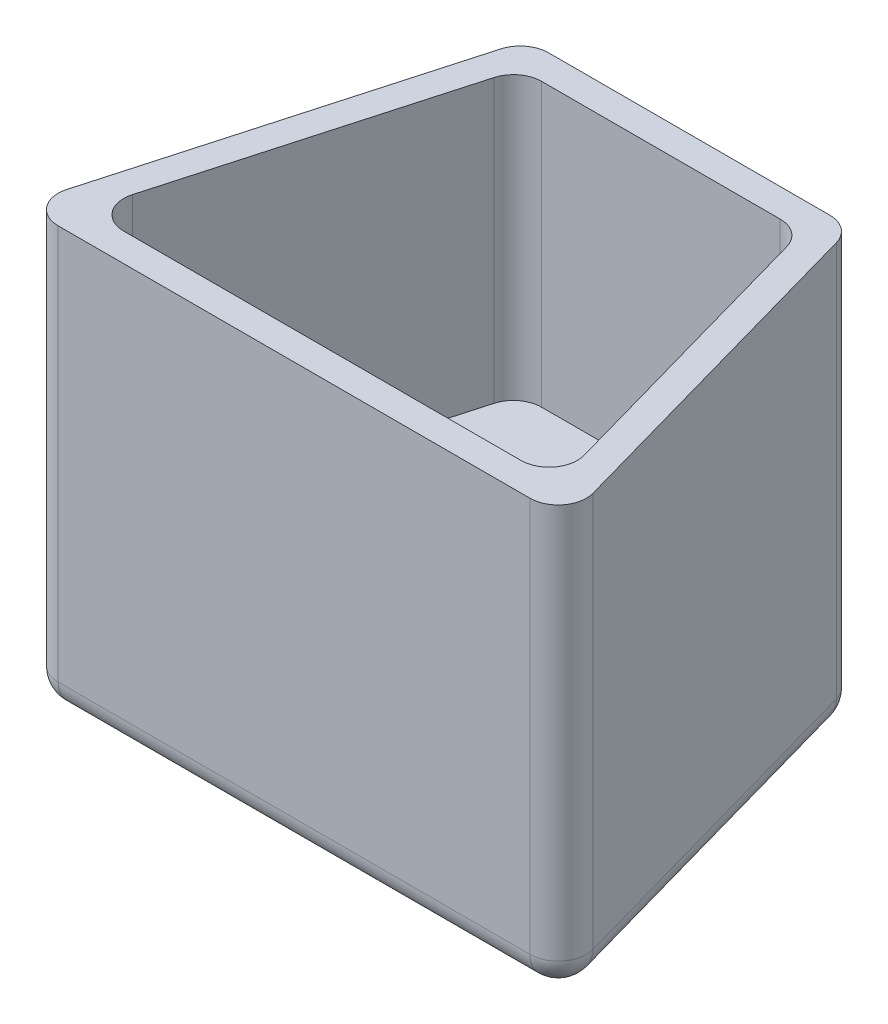
ISO-10303-21;
HEADER;
FILE_DESCRIPTION(('STEP AP214'),'2;1');
FILE_NAME('part.step','',(''),(''),'','','');
FILE_SCHEMA(('AUTOMOTIVE_DESIGN { 1 0 10303 214 1 1 1 1 }'));
ENDSEC;
DATA;
#1=APPLICATION_CONTEXT('core data for automotive mechanical design processes');
#2=APPLICATION_PROTOCOL_DEFINITION('international standard','automotive_design',2000,#1);
#3=PRODUCT_CONTEXT('',#1,'mechanical');
#4=PRODUCT('Part','Part','',(#3));
#5=PRODUCT_RELATED_PRODUCT_CATEGORY('part','',(#4));
#6=PRODUCT_DEFINITION_FORMATION('','',#4);
#7=PRODUCT_DEFINITION_CONTEXT('part definition',#1,'design');
#8=PRODUCT_DEFINITION('design','',#6,#7);
#9=PRODUCT_DEFINITION_SHAPE('','',#8);
#10=(LENGTH_UNIT() NAMED_UNIT(*) SI_UNIT(.MILLI.,.METRE.));
#11=(NAMED_UNIT(*) PLANE_ANGLE_UNIT() SI_UNIT($,.RADIAN.));
#12=(NAMED_UNIT(*) SI_UNIT($,.STERADIAN.) SOLID_ANGLE_UNIT());
#13=UNCERTAINTY_MEASURE_WITH_UNIT(LENGTH_MEASURE(1.E-05),#10,'distance_accuracy_value','');
#14=(GEOMETRIC_REPRESENTATION_CONTEXT(3) GLOBAL_UNCERTAINTY_ASSIGNED_CONTEXT((#13)) GLOBAL_UNIT_ASSIGNED_CONTEXT((#10,
#11,#12)) REPRESENTATION_CONTEXT('',''));
#15=CARTESIAN_POINT('',(0.,0.,0.));
#16=DIRECTION('',(0.,0.,1.));
#17=DIRECTION('',(1.,0.,0.));
#18=AXIS2_PLACEMENT_3D('',#15,#16,#17);
#19=CARTESIAN_POINT('',(4.98490373267567,1.,-6.));
#20=DIRECTION('',(0.,0.,-1.));
#21=DIRECTION('',(0.,1.,0.));
#22=AXIS2_PLACEMENT_3D('',#19,#20,#21);
#23=SPHERICAL_SURFACE('',#22,1.);
#24=CARTESIAN_POINT('',(4.98490373267567,1.,-6.));
#25=DIRECTION('',(1.,0.,0.));
#26=DIRECTION('',(0.,0.,-1.));
#27=AXIS2_PLACEMENT_3D('',#24,#25,#26);
#28=CIRCLE('',#27,1.);
#29=CARTESIAN_POINT('',(4.98490373267567,1.,-7.));
#30=VERTEX_POINT('',#29);
#31=CARTESIAN_POINT('',(4.98490373267566,0.,-6.));
#32=VERTEX_POINT('',#31);
#33=EDGE_CURVE('E288',#30,#32,#28,.F.);
#34=ORIENTED_EDGE('',*,*,#33,.F.);
#35=CARTESIAN_POINT('',(4.98490373267567,1.,-6.));
#36=DIRECTION('',(0.,-1.,0.));
#37=DIRECTION('',(0.,0.,-1.));
#38=AXIS2_PLACEMENT_3D('',#35,#36,#37);
#39=CIRCLE('',#38,0.999999999999998);
#40=CARTESIAN_POINT('',(5.94755467282956,1.,-6.27074557691828));
#41=VERTEX_POINT('',#40);
#42=EDGE_CURVE('E296',#41,#30,#39,.F.);
#43=ORIENTED_EDGE('',*,*,#42,.F.);
#44=CARTESIAN_POINT('',(4.98490373267566,1.,-6.));
#45=DIRECTION('',(0.270745576918284,0.,0.962650940153899));
#46=DIRECTION('',(0.962650940153899,0.,-0.270745576918284));
#47=AXIS2_PLACEMENT_3D('',#44,#45,#46);
#48=CIRCLE('',#47,1.);
#49=EDGE_CURVE('E287',#32,#41,#48,.T.);
#50=ORIENTED_EDGE('',*,*,#49,.F.);
#51=EDGE_LOOP('',(#34,#43,#50));
#52=FACE_BOUND('',#51,.T.);
#53=ADVANCED_FACE('F17',(#52),#23,.T.);
#54=CARTESIAN_POINT('',(-4.98490373267567,1.,-6.));
#55=DIRECTION('',(0.,0.,-1.));
#56=DIRECTION('',(0.,1.,0.));
#57=AXIS2_PLACEMENT_3D('',#54,#55,#56);
#58=SPHERICAL_SURFACE('',#57,1.);
#59=CARTESIAN_POINT('',(-4.98490373267567,1.,-6.));
#60=DIRECTION('',(1.,0.,0.));
#61=DIRECTION('',(0.,0.,-1.));
#62=AXIS2_PLACEMENT_3D('',#59,#60,#61);
#63=CIRCLE('',#62,1.);
#64=CARTESIAN_POINT('',(-4.98490373267567,0.,-6.));
#65=VERTEX_POINT('',#64);
#66=CARTESIAN_POINT('',(-4.98490373267567,1.,-7.));
#67=VERTEX_POINT('',#66);
#68=EDGE_CURVE('E285',#65,#67,#63,.T.);
#69=ORIENTED_EDGE('',*,*,#68,.F.);
#70=CARTESIAN_POINT('',(-4.98490373267566,1.,-6.));
#71=DIRECTION('',(0.270745576918284,0.,-0.962650940153899));
#72=DIRECTION('',(-0.962650940153899,0.,-0.270745576918284));
#73=AXIS2_PLACEMENT_3D('',#70,#71,#72);
#74=CIRCLE('',#73,1.);
#75=CARTESIAN_POINT('',(-5.94755467282956,0.999999999999997,-6.27074557691828));
#76=VERTEX_POINT('',#75);
#77=EDGE_CURVE('E427',#76,#65,#74,.F.);
#78=ORIENTED_EDGE('',*,*,#77,.F.);
#79=CARTESIAN_POINT('',(-4.98490373267567,1.,-6.));
#80=DIRECTION('',(0.,-1.,0.));
#81=DIRECTION('',(0.,0.,-1.));
#82=AXIS2_PLACEMENT_3D('',#79,#80,#81);
#83=CIRCLE('',#82,0.999999999999999);
#84=EDGE_CURVE('E280',#67,#76,#83,.F.);
#85=ORIENTED_EDGE('',*,*,#84,.F.);
#86=EDGE_LOOP('',(#69,#78,#85));
#87=FACE_BOUND('',#86,.T.);
#88=ADVANCED_FACE('F319',(#87),#58,.T.);
#89=CARTESIAN_POINT('',(4.2273555990135,15.,-5.));
#90=DIRECTION('',(0.,-1.,0.));
#91=DIRECTION('',(0.,0.,-1.));
#92=AXIS2_PLACEMENT_3D('',#89,#90,#91);
#93=CYLINDRICAL_SURFACE('',#92,0.999999999999999);
#94=CARTESIAN_POINT('',(4.2273555990135,5.,-5.));
#95=DIRECTION('',(0.,-1.,0.));
#96=DIRECTION('',(0.,0.,-1.));
#97=AXIS2_PLACEMENT_3D('',#94,#95,#96);
#98=CIRCLE('',#97,0.999999999999999);
#99=CARTESIAN_POINT('',(4.2273555990135,5.,-6.));
#100=VERTEX_POINT('',#99);
#101=CARTESIAN_POINT('',(5.1900065391674,5.,-5.27074557691828));
#102=VERTEX_POINT('',#101);
#103=EDGE_CURVE('E158',#100,#102,#98,.T.);
#104=ORIENTED_EDGE('',*,*,#103,.T.);
#105=DIRECTION('',(0.,1.,0.));
#106=VECTOR('',#105,1.);
#107=CARTESIAN_POINT('',(5.1900065391674,15.,-5.27074557691828));
#108=LINE('',#107,#106);
#109=CARTESIAN_POINT('',(5.1900065391674,15.,-5.27074557691828));
#110=VERTEX_POINT('',#109);
#111=EDGE_CURVE('E156',#110,#102,#108,.F.);
#112=ORIENTED_EDGE('',*,*,#111,.F.);
#113=CARTESIAN_POINT('',(4.2273555990135,15.,-5.));
#114=DIRECTION('',(0.,-1.,0.));
#115=DIRECTION('',(0.,0.,-1.));
#116=AXIS2_PLACEMENT_3D('',#113,#114,#115);
#117=CIRCLE('',#116,0.999999999999999);
#118=CARTESIAN_POINT('',(4.2273555990135,15.,-6.));
#119=VERTEX_POINT('',#118);
#120=EDGE_CURVE('E21',#119,#110,#117,.T.);
#121=ORIENTED_EDGE('',*,*,#120,.F.);
#122=DIRECTION('',(0.,1.,0.));
#123=VECTOR('',#122,1.);
#124=CARTESIAN_POINT('',(4.22735559901349,15.,-6.));
#125=LINE('',#124,#123);
#126=EDGE_CURVE('E252',#100,#119,#125,.T.);
#127=ORIENTED_EDGE('',*,*,#126,.F.);
#128=EDGE_LOOP('',(#104,#112,#121,#127));
#129=FACE_BOUND('',#128,.T.);
#130=ADVANCED_FACE('F157',(#129),#93,.F.);
#131=CARTESIAN_POINT('',(-4.2273555990135,15.,-5.));
#132=DIRECTION('',(0.,-1.,0.));
#133=DIRECTION('',(0.,0.,-1.));
#134=AXIS2_PLACEMENT_3D('',#131,#132,#133);
#135=CYLINDRICAL_SURFACE('',#134,1.);
#136=CARTESIAN_POINT('',(-4.2273555990135,5.,-5.));
#137=DIRECTION('',(0.,-1.,0.));
#138=DIRECTION('',(0.,0.,-1.));
#139=AXIS2_PLACEMENT_3D('',#136,#137,#138);
#140=CIRCLE('',#139,1.);
#141=CARTESIAN_POINT('',(-5.1900065391674,5.,-5.27074557691828));
#142=VERTEX_POINT('',#141);
#143=CARTESIAN_POINT('',(-4.2273555990135,5.,-6.));
#144=VERTEX_POINT('',#143);
#145=EDGE_CURVE('E432',#142,#144,#140,.T.);
#146=ORIENTED_EDGE('',*,*,#145,.T.);
#147=DIRECTION('',(0.,1.,0.));
#148=VECTOR('',#147,1.);
#149=CARTESIAN_POINT('',(-4.22735559901349,15.,-6.));
#150=LINE('',#149,#148);
#151=CARTESIAN_POINT('',(-4.2273555990135,15.,-6.));
#152=VERTEX_POINT('',#151);
#153=EDGE_CURVE('E255',#152,#144,#150,.F.);
#154=ORIENTED_EDGE('',*,*,#153,.F.);
#155=CARTESIAN_POINT('',(-4.2273555990135,15.,-5.));
#156=DIRECTION('',(0.,-1.,0.));
#157=DIRECTION('',(0.,0.,-1.));
#158=AXIS2_PLACEMENT_3D('',#155,#156,#157);
#159=CIRCLE('',#158,1.);
#160=CARTESIAN_POINT('',(-5.1900065391674,15.,-5.27074557691828));
#161=VERTEX_POINT('',#160);
#162=EDGE_CURVE('E154',#161,#152,#159,.T.);
#163=ORIENTED_EDGE('',*,*,#162,.F.);
#164=DIRECTION('',(0.,1.,0.));
#165=VECTOR('',#164,1.);
#166=CARTESIAN_POINT('',(-5.1900065391674,15.,-5.27074557691828));
#167=LINE('',#166,#165);
#168=EDGE_CURVE('E248',#142,#161,#167,.T.);
#169=ORIENTED_EDGE('',*,*,#168,.F.);
#170=EDGE_LOOP('',(#146,#154,#163,#169));
#171=FACE_BOUND('',#170,.T.);
#172=ADVANCED_FACE('F325',(#171),#135,.F.);
#173=CARTESIAN_POINT('',(-8.35990373267567,5.,6.));
#174=DIRECTION('',(0.,-1.,0.));
#175=DIRECTION('',(0.,0.,-1.));
#176=AXIS2_PLACEMENT_3D('',#173,#174,#175);
#177=PLANE('',#176);
#178=DIRECTION('',(-1.,0.,0.));
#179=VECTOR('',#178,1.);
#180=CARTESIAN_POINT('',(-7.03985559901349,5.,6.));
#181=LINE('',#180,#179);
#182=CARTESIAN_POINT('',(7.0398555990135,5.,6.));
#183=VERTEX_POINT('',#182);
#184=CARTESIAN_POINT('',(-7.0398555990135,5.,6.));
#185=VERTEX_POINT('',#184);
#186=EDGE_CURVE('E261',#183,#185,#181,.T.);
#187=ORIENTED_EDGE('',*,*,#186,.F.);
#188=CARTESIAN_POINT('',(7.0398555990135,5.,5.));
#189=DIRECTION('',(0.,-1.,0.));
#190=DIRECTION('',(0.,0.,-1.));
#191=AXIS2_PLACEMENT_3D('',#188,#189,#190);
#192=CIRCLE('',#191,1.);
#193=CARTESIAN_POINT('',(8.0025065391674,5.,4.72925442308172));
#194=VERTEX_POINT('',#193);
#195=EDGE_CURVE('E162',#183,#194,#192,.F.);
#196=ORIENTED_EDGE('',*,*,#195,.T.);
#197=DIRECTION('',(0.270745576918284,0.,0.962650940153899));
#198=VECTOR('',#197,1.);
#199=CARTESIAN_POINT('',(5.1900065391674,5.,-5.27074557691828));
#200=LINE('',#199,#198);
#201=EDGE_CURVE('E161',#102,#194,#200,.T.);
#202=ORIENTED_EDGE('',*,*,#201,.F.);
#203=ORIENTED_EDGE('',*,*,#103,.F.);
#204=DIRECTION('',(1.,0.,0.));
#205=VECTOR('',#204,1.);
#206=CARTESIAN_POINT('',(-4.22735559901349,5.,-6.));
#207=LINE('',#206,#205);
#208=EDGE_CURVE('E254',#144,#100,#207,.T.);
#209=ORIENTED_EDGE('',*,*,#208,.F.);
#210=ORIENTED_EDGE('',*,*,#145,.F.);
#211=DIRECTION('',(0.270745576918284,0.,-0.962650940153899));
#212=VECTOR('',#211,1.);
#213=CARTESIAN_POINT('',(-5.1900065391674,5.,-5.27074557691828));
#214=LINE('',#213,#212);
#215=CARTESIAN_POINT('',(-8.0025065391674,5.,4.72925442308171));
#216=VERTEX_POINT('',#215);
#217=EDGE_CURVE('E251',#216,#142,#214,.T.);
#218=ORIENTED_EDGE('',*,*,#217,.F.);
#219=CARTESIAN_POINT('',(-7.0398555990135,5.,5.));
#220=DIRECTION('',(0.,-1.,0.));
#221=DIRECTION('',(0.,0.,-1.));
#222=AXIS2_PLACEMENT_3D('',#219,#220,#221);
#223=CIRCLE('',#222,1.);
#224=EDGE_CURVE('E244',#216,#185,#223,.F.);
#225=ORIENTED_EDGE('',*,*,#224,.T.);
#226=EDGE_LOOP('',(#187,#196,#202,#203,#209,#210,#218,#225));
#227=FACE_BOUND('',#226,.T.);
#228=ADVANCED_FACE('F328',(#227),#177,.F.);
#229=CARTESIAN_POINT('',(4.98490373267567,15.,-6.));
#230=DIRECTION('',(0.,-1.,0.));
#231=DIRECTION('',(0.,0.,-1.));
#232=AXIS2_PLACEMENT_3D('',#229,#230,#231);
#233=CYLINDRICAL_SURFACE('',#232,0.999999999999998);
#234=DIRECTION('',(0.,1.,0.));
#235=VECTOR('',#234,1.);
#236=CARTESIAN_POINT('',(4.98490373267567,15.,-7.));
#237=LINE('',#236,#235);
#238=CARTESIAN_POINT('',(4.98490373267567,15.,-7.));
#239=VERTEX_POINT('',#238);
#240=EDGE_CURVE('E272',#30,#239,#237,.T.);
#241=ORIENTED_EDGE('',*,*,#240,.T.);
#242=CARTESIAN_POINT('',(4.98490373267567,15.,-6.));
#243=DIRECTION('',(0.,-1.,0.));
#244=DIRECTION('',(0.,0.,-1.));
#245=AXIS2_PLACEMENT_3D('',#242,#243,#244);
#246=CIRCLE('',#245,0.999999999999998);
#247=CARTESIAN_POINT('',(5.94755467282956,15.,-6.27074557691829));
#248=VERTEX_POINT('',#247);
#249=EDGE_CURVE('E298',#239,#248,#246,.T.);
#250=ORIENTED_EDGE('',*,*,#249,.T.);
#251=DIRECTION('',(0.,1.,0.));
#252=VECTOR('',#251,1.);
#253=CARTESIAN_POINT('',(5.94755467282956,15.,-6.27074557691828));
#254=LINE('',#253,#252);
#255=EDGE_CURVE('E237',#248,#41,#254,.F.);
#256=ORIENTED_EDGE('',*,*,#255,.T.);
#257=ORIENTED_EDGE('',*,*,#42,.T.);
#258=EDGE_LOOP('',(#241,#250,#256,#257));
#259=FACE_BOUND('',#258,.T.);
#260=ADVANCED_FACE('F332',(#259),#233,.T.);
#261=CARTESIAN_POINT('',(-4.98490373267567,1.,-6.));
#262=DIRECTION('',(1.,0.,0.));
#263=DIRECTION('',(0.,0.,-1.));
#264=AXIS2_PLACEMENT_3D('',#261,#262,#263);
#265=CYLINDRICAL_SURFACE('',#264,1.);
#266=ORIENTED_EDGE('',*,*,#68,.T.);
#267=DIRECTION('',(1.,0.,0.));
#268=VECTOR('',#267,1.);
#269=CARTESIAN_POINT('',(-4.98490373267567,1.,-7.));
#270=LINE('',#269,#268);
#271=EDGE_CURVE('E268',#67,#30,#270,.T.);
#272=ORIENTED_EDGE('',*,*,#271,.T.);
#273=ORIENTED_EDGE('',*,*,#33,.T.);
#274=DIRECTION('',(1.,0.,0.));
#275=VECTOR('',#274,1.);
#276=CARTESIAN_POINT('',(-8.35990373267567,0.,-6.));
#277=LINE('',#276,#275);
#278=EDGE_CURVE('E291',#65,#32,#277,.T.);
#279=ORIENTED_EDGE('',*,*,#278,.F.);
#280=EDGE_LOOP('',(#266,#272,#273,#279));
#281=FACE_BOUND('',#280,.T.);
#282=ADVANCED_FACE('F336',(#281),#265,.T.);
#283=CARTESIAN_POINT('',(4.98490373267566,1.,-6.));
#284=DIRECTION('',(0.270745576918284,0.,0.962650940153899));
#285=DIRECTION('',(0.962650940153899,0.,-0.270745576918284));
#286=AXIS2_PLACEMENT_3D('',#283,#284,#285);
#287=CYLINDRICAL_SURFACE('',#286,1.);
#288=CARTESIAN_POINT('',(8.35990373267567,1.,6.00000000000001));
#289=DIRECTION('',(0.270745576918284,0.,0.962650940153899));
#290=DIRECTION('',(0.962650940153899,0.,-0.270745576918284));
#291=AXIS2_PLACEMENT_3D('',#288,#289,#290);
#292=CIRCLE('',#291,1.);
#293=CARTESIAN_POINT('',(8.35990373267568,0.,6.00000000000001));
#294=VERTEX_POINT('',#293);
#295=CARTESIAN_POINT('',(9.32255467282957,1.,5.72925442308172));
#296=VERTEX_POINT('',#295);
#297=EDGE_CURVE('E238',#294,#296,#292,.T.);
#298=ORIENTED_EDGE('',*,*,#297,.F.);
#299=DIRECTION('',(0.270745576918284,0.,0.962650940153899));
#300=VECTOR('',#299,1.);
#301=CARTESIAN_POINT('',(4.98490373267567,0.,-6.));
#302=LINE('',#301,#300);
#303=EDGE_CURVE('E294',#32,#294,#302,.T.);
#304=ORIENTED_EDGE('',*,*,#303,.F.);
#305=ORIENTED_EDGE('',*,*,#49,.T.);
#306=DIRECTION('',(0.270745576918284,0.,0.962650940153899));
#307=VECTOR('',#306,1.);
#308=CARTESIAN_POINT('',(5.94755467282956,1.,-6.27074557691828));
#309=LINE('',#308,#307);
#310=EDGE_CURVE('E264',#41,#296,#309,.T.);
#311=ORIENTED_EDGE('',*,*,#310,.T.);
#312=EDGE_LOOP('',(#298,#304,#305,#311));
#313=FACE_BOUND('',#312,.T.);
#314=ADVANCED_FACE('F340',(#313),#287,.T.);
#315=CARTESIAN_POINT('',(-4.98490373267566,1.,-6.));
#316=DIRECTION('',(0.270745576918284,0.,-0.962650940153899));
#317=DIRECTION('',(-0.962650940153899,0.,-0.270745576918284));
#318=AXIS2_PLACEMENT_3D('',#315,#316,#317);
#319=CYLINDRICAL_SURFACE('',#318,1.);
#320=CARTESIAN_POINT('',(-8.35990373267567,1.,6.00000000000001));
#321=DIRECTION('',(0.270745576918284,0.,-0.962650940153899));
#322=DIRECTION('',(-0.962650940153899,0.,-0.270745576918284));
#323=AXIS2_PLACEMENT_3D('',#320,#321,#322);
#324=CIRCLE('',#323,1.);
#325=CARTESIAN_POINT('',(-8.35990373267567,0.,6.00000000000001));
#326=VERTEX_POINT('',#325);
#327=CARTESIAN_POINT('',(-9.32255467282957,0.999999999999997,5.72925442308172));
#328=VERTEX_POINT('',#327);
#329=EDGE_CURVE('E282',#326,#328,#324,.T.);
#330=ORIENTED_EDGE('',*,*,#329,.T.);
#331=DIRECTION('',(0.270745576918284,0.,-0.962650940153899));
#332=VECTOR('',#331,1.);
#333=CARTESIAN_POINT('',(-5.94755467282956,0.999999999999994,-6.27074557691828));
#334=LINE('',#333,#332);
#335=EDGE_CURVE('E279',#328,#76,#334,.T.);
#336=ORIENTED_EDGE('',*,*,#335,.T.);
#337=ORIENTED_EDGE('',*,*,#77,.T.);
#338=DIRECTION('',(0.270745576918284,0.,-0.962650940153899));
#339=VECTOR('',#338,1.);
#340=CARTESIAN_POINT('',(-8.35990373267567,0.,6.));
#341=LINE('',#340,#339);
#342=EDGE_CURVE('E295',#326,#65,#341,.T.);
#343=ORIENTED_EDGE('',*,*,#342,.F.);
#344=EDGE_LOOP('',(#330,#336,#337,#343));
#345=FACE_BOUND('',#344,.T.);
#346=ADVANCED_FACE('F344',(#345),#319,.T.);
#347=CARTESIAN_POINT('',(-4.98490373267567,15.,-6.));
#348=DIRECTION('',(0.,-1.,0.));
#349=DIRECTION('',(0.,0.,-1.));
#350=AXIS2_PLACEMENT_3D('',#347,#348,#349);
#351=CYLINDRICAL_SURFACE('',#350,0.999999999999999);
#352=DIRECTION('',(0.,1.,0.));
#353=VECTOR('',#352,1.);
#354=CARTESIAN_POINT('',(-5.94755467282956,15.,-6.27074557691828));
#355=LINE('',#354,#353);
#356=CARTESIAN_POINT('',(-5.94755467282956,15.,-6.27074557691828));
#357=VERTEX_POINT('',#356);
#358=EDGE_CURVE('E186',#76,#357,#355,.T.);
#359=ORIENTED_EDGE('',*,*,#358,.T.);
#360=CARTESIAN_POINT('',(-4.98490373267567,15.,-6.));
#361=DIRECTION('',(0.,-1.,0.));
#362=DIRECTION('',(0.,0.,-1.));
#363=AXIS2_PLACEMENT_3D('',#360,#361,#362);
#364=CIRCLE('',#363,0.999999999999999);
#365=CARTESIAN_POINT('',(-4.98490373267567,15.,-7.));
#366=VERTEX_POINT('',#365);
#367=EDGE_CURVE('E269',#357,#366,#364,.T.);
#368=ORIENTED_EDGE('',*,*,#367,.T.);
#369=DIRECTION('',(0.,1.,0.));
#370=VECTOR('',#369,1.);
#371=CARTESIAN_POINT('',(-4.98490373267567,15.,-7.));
#372=LINE('',#371,#370);
#373=EDGE_CURVE('E265',#366,#67,#372,.F.);
#374=ORIENTED_EDGE('',*,*,#373,.T.);
#375=ORIENTED_EDGE('',*,*,#84,.T.);
#376=EDGE_LOOP('',(#359,#368,#374,#375));
#377=FACE_BOUND('',#376,.T.);
#378=ADVANCED_FACE('F348',(#377),#351,.T.);
#379=CARTESIAN_POINT('',(-4.98490373267567,15.,-7.));
#380=DIRECTION('',(0.,0.,1.));
#381=DIRECTION('',(1.,0.,0.));
#382=AXIS2_PLACEMENT_3D('',#379,#380,#381);
#383=PLANE('',#382);
#384=ORIENTED_EDGE('',*,*,#271,.F.);
#385=ORIENTED_EDGE('',*,*,#373,.F.);
#386=DIRECTION('',(1.,0.,0.));
#387=VECTOR('',#386,1.);
#388=CARTESIAN_POINT('',(-8.35990373267567,15.,-7.));
#389=LINE('',#388,#387);
#390=EDGE_CURVE('E180',#366,#239,#389,.T.);
#391=ORIENTED_EDGE('',*,*,#390,.T.);
#392=ORIENTED_EDGE('',*,*,#240,.F.);
#393=EDGE_LOOP('',(#384,#385,#391,#392));
#394=FACE_BOUND('',#393,.T.);
#395=ADVANCED_FACE('F352',(#394),#383,.F.);
#396=CARTESIAN_POINT('',(-7.03985559901349,15.,6.));
#397=DIRECTION('',(0.,0.,-1.));
#398=DIRECTION('',(-1.,0.,0.));
#399=AXIS2_PLACEMENT_3D('',#396,#397,#398);
#400=PLANE('',#399);
#401=DIRECTION('',(0.,-1.,0.));
#402=VECTOR('',#401,1.);
#403=CARTESIAN_POINT('',(-7.03985559901349,15.,6.));
#404=LINE('',#403,#402);
#405=CARTESIAN_POINT('',(-7.0398555990135,15.,6.));
#406=VERTEX_POINT('',#405);
#407=EDGE_CURVE('E241',#185,#406,#404,.F.);
#408=ORIENTED_EDGE('',*,*,#407,.T.);
#409=DIRECTION('',(1.,0.,0.));
#410=VECTOR('',#409,1.);
#411=CARTESIAN_POINT('',(-8.35990373267567,15.,6.));
#412=LINE('',#411,#410);
#413=CARTESIAN_POINT('',(7.0398555990135,15.,6.));
#414=VERTEX_POINT('',#413);
#415=EDGE_CURVE('E171',#406,#414,#412,.T.);
#416=ORIENTED_EDGE('',*,*,#415,.T.);
#417=DIRECTION('',(0.,-1.,0.));
#418=VECTOR('',#417,1.);
#419=CARTESIAN_POINT('',(7.03985559901349,15.,6.));
#420=LINE('',#419,#418);
#421=EDGE_CURVE('E258',#414,#183,#420,.T.);
#422=ORIENTED_EDGE('',*,*,#421,.T.);
#423=ORIENTED_EDGE('',*,*,#186,.T.);
#424=EDGE_LOOP('',(#408,#416,#422,#423));
#425=FACE_BOUND('',#424,.T.);
#426=ADVANCED_FACE('F356',(#425),#400,.T.);
#427=CARTESIAN_POINT('',(7.0398555990135,15.,5.));
#428=DIRECTION('',(0.,-1.,0.));
#429=DIRECTION('',(0.,0.,-1.));
#430=AXIS2_PLACEMENT_3D('',#427,#428,#429);
#431=CYLINDRICAL_SURFACE('',#430,1.);
#432=ORIENTED_EDGE('',*,*,#195,.F.);
#433=ORIENTED_EDGE('',*,*,#421,.F.);
#434=CARTESIAN_POINT('',(7.0398555990135,15.,5.));
#435=DIRECTION('',(0.,-1.,0.));
#436=DIRECTION('',(0.,0.,-1.));
#437=AXIS2_PLACEMENT_3D('',#434,#435,#436);
#438=CIRCLE('',#437,1.);
#439=CARTESIAN_POINT('',(8.0025065391674,15.,4.72925442308172));
#440=VERTEX_POINT('',#439);
#441=EDGE_CURVE('E167',#414,#440,#438,.F.);
#442=ORIENTED_EDGE('',*,*,#441,.T.);
#443=DIRECTION('',(0.,1.,0.));
#444=VECTOR('',#443,1.);
#445=CARTESIAN_POINT('',(8.0025065391674,15.,4.72925442308171));
#446=LINE('',#445,#444);
#447=EDGE_CURVE('E166',#194,#440,#446,.T.);
#448=ORIENTED_EDGE('',*,*,#447,.F.);
#449=EDGE_LOOP('',(#432,#433,#442,#448));
#450=FACE_BOUND('',#449,.T.);
#451=ADVANCED_FACE('F360',(#450),#431,.F.);
#452=CARTESIAN_POINT('',(5.1900065391674,15.,-5.27074557691828));
#453=DIRECTION('',(-0.962650940153899,0.,0.270745576918284));
#454=DIRECTION('',(0.270745576918284,0.,0.962650940153899));
#455=AXIS2_PLACEMENT_3D('',#452,#453,#454);
#456=PLANE('',#455);
#457=ORIENTED_EDGE('',*,*,#447,.T.);
#458=DIRECTION('',(-0.270745576918284,0.,-0.962650940153899));
#459=VECTOR('',#458,1.);
#460=CARTESIAN_POINT('',(8.0025065391674,15.,4.72925442308171));
#461=LINE('',#460,#459);
#462=EDGE_CURVE('E150',#440,#110,#461,.T.);
#463=ORIENTED_EDGE('',*,*,#462,.T.);
#464=ORIENTED_EDGE('',*,*,#111,.T.);
#465=ORIENTED_EDGE('',*,*,#201,.T.);
#466=EDGE_LOOP('',(#457,#463,#464,#465));
#467=FACE_BOUND('',#466,.T.);
#468=ADVANCED_FACE('F164',(#467),#456,.T.);
#469=CARTESIAN_POINT('',(-4.22735559901349,15.,-6.));
#470=DIRECTION('',(0.,0.,1.));
#471=DIRECTION('',(1.,0.,0.));
#472=AXIS2_PLACEMENT_3D('',#469,#470,#471);
#473=PLANE('',#472);
#474=ORIENTED_EDGE('',*,*,#126,.T.);
#475=DIRECTION('',(1.,0.,0.));
#476=VECTOR('',#475,1.);
#477=CARTESIAN_POINT('',(-8.35990373267567,15.,-6.));
#478=LINE('',#477,#476);
#479=EDGE_CURVE('E153',#119,#152,#478,.F.);
#480=ORIENTED_EDGE('',*,*,#479,.T.);
#481=ORIENTED_EDGE('',*,*,#153,.T.);
#482=ORIENTED_EDGE('',*,*,#208,.T.);
#483=EDGE_LOOP('',(#474,#480,#481,#482));
#484=FACE_BOUND('',#483,.T.);
#485=ADVANCED_FACE('F367',(#484),#473,.T.);
#486=CARTESIAN_POINT('',(-5.1900065391674,15.,-5.27074557691828));
#487=DIRECTION('',(0.962650940153899,0.,0.270745576918284));
#488=DIRECTION('',(0.270745576918284,0.,-0.962650940153899));
#489=AXIS2_PLACEMENT_3D('',#486,#487,#488);
#490=PLANE('',#489);
#491=ORIENTED_EDGE('',*,*,#168,.T.);
#492=DIRECTION('',(-0.270745576918284,0.,0.962650940153899));
#493=VECTOR('',#492,1.);
#494=CARTESIAN_POINT('',(-5.1900065391674,15.,-5.27074557691828));
#495=LINE('',#494,#493);
#496=CARTESIAN_POINT('',(-8.0025065391674,15.,4.72925442308171));
#497=VERTEX_POINT('',#496);
#498=EDGE_CURVE('E169',#161,#497,#495,.T.);
#499=ORIENTED_EDGE('',*,*,#498,.T.);
#500=DIRECTION('',(0.,-1.,0.));
#501=VECTOR('',#500,1.);
#502=CARTESIAN_POINT('',(-8.0025065391674,15.,4.72925442308171));
#503=LINE('',#502,#501);
#504=EDGE_CURVE('E245',#497,#216,#503,.T.);
#505=ORIENTED_EDGE('',*,*,#504,.T.);
#506=ORIENTED_EDGE('',*,*,#217,.T.);
#507=EDGE_LOOP('',(#491,#499,#505,#506));
#508=FACE_BOUND('',#507,.T.);
#509=ADVANCED_FACE('F369',(#508),#490,.T.);
#510=CARTESIAN_POINT('',(-7.0398555990135,15.,5.));
#511=DIRECTION('',(0.,-1.,0.));
#512=DIRECTION('',(0.,0.,-1.));
#513=AXIS2_PLACEMENT_3D('',#510,#511,#512);
#514=CYLINDRICAL_SURFACE('',#513,1.);
#515=ORIENTED_EDGE('',*,*,#224,.F.);
#516=ORIENTED_EDGE('',*,*,#504,.F.);
#517=CARTESIAN_POINT('',(-7.0398555990135,15.,5.));
#518=DIRECTION('',(0.,-1.,0.));
#519=DIRECTION('',(0.,0.,-1.));
#520=AXIS2_PLACEMENT_3D('',#517,#518,#519);
#521=CIRCLE('',#520,1.);
#522=EDGE_CURVE('E417',#497,#406,#521,.F.);
#523=ORIENTED_EDGE('',*,*,#522,.T.);
#524=ORIENTED_EDGE('',*,*,#407,.F.);
#525=EDGE_LOOP('',(#515,#516,#523,#524));
#526=FACE_BOUND('',#525,.T.);
#527=ADVANCED_FACE('F227',(#526),#514,.F.);
#528=CARTESIAN_POINT('',(8.35990373267567,1.,6.));
#529=DIRECTION('',(0.,0.,-1.));
#530=DIRECTION('',(0.,1.,0.));
#531=AXIS2_PLACEMENT_3D('',#528,#529,#530);
#532=SPHERICAL_SURFACE('',#531,1.);
#533=CARTESIAN_POINT('',(8.35990373267567,1.,6.));
#534=DIRECTION('',(0.,-1.,0.));
#535=DIRECTION('',(0.,0.,-1.));
#536=AXIS2_PLACEMENT_3D('',#533,#534,#535);
#537=CIRCLE('',#536,1.);
#538=CARTESIAN_POINT('',(8.35990373267567,1.,7.));
#539=VERTEX_POINT('',#538);
#540=EDGE_CURVE('E405',#539,#296,#537,.F.);
#541=ORIENTED_EDGE('',*,*,#540,.F.);
#542=CARTESIAN_POINT('',(8.35990373267567,1.,6.));
#543=DIRECTION('',(-1.,0.,0.));
#544=DIRECTION('',(0.,0.,-1.));
#545=AXIS2_PLACEMENT_3D('',#542,#543,#544);
#546=CIRCLE('',#545,1.);
#547=EDGE_CURVE('E235',#539,#294,#546,.F.);
#548=ORIENTED_EDGE('',*,*,#547,.T.);
#549=ORIENTED_EDGE('',*,*,#297,.T.);
#550=EDGE_LOOP('',(#541,#548,#549));
#551=FACE_BOUND('',#550,.T.);
#552=ADVANCED_FACE('F222',(#551),#532,.T.);
#553=CARTESIAN_POINT('',(5.94755467282956,15.,-6.27074557691828));
#554=DIRECTION('',(-0.962650940153899,0.,0.270745576918284));
#555=DIRECTION('',(0.270745576918284,0.,0.962650940153899));
#556=AXIS2_PLACEMENT_3D('',#553,#554,#555);
#557=PLANE('',#556);
#558=ORIENTED_EDGE('',*,*,#310,.F.);
#559=ORIENTED_EDGE('',*,*,#255,.F.);
#560=DIRECTION('',(0.270745576918284,0.,0.962650940153899));
#561=VECTOR('',#560,1.);
#562=CARTESIAN_POINT('',(5.94755467282956,15.,-6.27074557691828));
#563=LINE('',#562,#561);
#564=CARTESIAN_POINT('',(9.32255467282957,15.,5.72925442308172));
#565=VERTEX_POINT('',#564);
#566=EDGE_CURVE('E177',#248,#565,#563,.T.);
#567=ORIENTED_EDGE('',*,*,#566,.T.);
#568=DIRECTION('',(0.,-1.,0.));
#569=VECTOR('',#568,1.);
#570=CARTESIAN_POINT('',(9.32255467282956,15.,5.72925442308172));
#571=LINE('',#570,#569);
#572=EDGE_CURVE('E400',#296,#565,#571,.F.);
#573=ORIENTED_EDGE('',*,*,#572,.F.);
#574=EDGE_LOOP('',(#558,#559,#567,#573));
#575=FACE_BOUND('',#574,.T.);
#576=ADVANCED_FACE('F218',(#575),#557,.F.);
#577=CARTESIAN_POINT('',(-8.35990373267567,0.,6.));
#578=DIRECTION('',(0.,-1.,0.));
#579=DIRECTION('',(0.,0.,-1.));
#580=AXIS2_PLACEMENT_3D('',#577,#578,#579);
#581=PLANE('',#580);
#582=ORIENTED_EDGE('',*,*,#278,.T.);
#583=ORIENTED_EDGE('',*,*,#303,.T.);
#584=DIRECTION('',(-1.,0.,0.));
#585=VECTOR('',#584,1.);
#586=CARTESIAN_POINT('',(-8.35990373267567,0.,6.));
#587=LINE('',#586,#585);
#588=EDGE_CURVE('E200',#326,#294,#587,.F.);
#589=ORIENTED_EDGE('',*,*,#588,.F.);
#590=ORIENTED_EDGE('',*,*,#342,.T.);
#591=EDGE_LOOP('',(#582,#583,#589,#590));
#592=FACE_BOUND('',#591,.T.);
#593=ADVANCED_FACE('F214',(#592),#581,.T.);
#594=CARTESIAN_POINT('',(-5.94755467282956,15.,-6.27074557691828));
#595=DIRECTION('',(0.962650940153899,0.,0.270745576918284));
#596=DIRECTION('',(0.270745576918284,0.,-0.962650940153899));
#597=AXIS2_PLACEMENT_3D('',#594,#595,#596);
#598=PLANE('',#597);
#599=ORIENTED_EDGE('',*,*,#335,.F.);
#600=DIRECTION('',(0.,-1.,0.));
#601=VECTOR('',#600,1.);
#602=CARTESIAN_POINT('',(-9.32255467282956,15.,5.72925442308172));
#603=LINE('',#602,#601);
#604=CARTESIAN_POINT('',(-9.32255467282957,15.,5.72925442308172));
#605=VERTEX_POINT('',#604);
#606=EDGE_CURVE('E198',#605,#328,#603,.T.);
#607=ORIENTED_EDGE('',*,*,#606,.F.);
#608=DIRECTION('',(0.270745576918284,0.,-0.962650940153899));
#609=VECTOR('',#608,1.);
#610=CARTESIAN_POINT('',(-9.32255467282957,15.,5.72925442308172));
#611=LINE('',#610,#609);
#612=EDGE_CURVE('E183',#605,#357,#611,.T.);
#613=ORIENTED_EDGE('',*,*,#612,.T.);
#614=ORIENTED_EDGE('',*,*,#358,.F.);
#615=EDGE_LOOP('',(#599,#607,#613,#614));
#616=FACE_BOUND('',#615,.T.);
#617=ADVANCED_FACE('F209',(#616),#598,.F.);
#618=CARTESIAN_POINT('',(-8.35990373267567,1.,6.));
#619=DIRECTION('',(0.,0.,-1.));
#620=DIRECTION('',(0.,1.,0.));
#621=AXIS2_PLACEMENT_3D('',#618,#619,#620);
#622=SPHERICAL_SURFACE('',#621,1.);
#623=ORIENTED_EDGE('',*,*,#329,.F.);
#624=CARTESIAN_POINT('',(-8.35990373267567,1.,6.));
#625=DIRECTION('',(-1.,0.,0.));
#626=DIRECTION('',(0.,0.,1.));
#627=AXIS2_PLACEMENT_3D('',#624,#625,#626);
#628=CIRCLE('',#627,1.);
#629=CARTESIAN_POINT('',(-8.35990373267567,1.,7.));
#630=VERTEX_POINT('',#629);
#631=EDGE_CURVE('E412',#630,#326,#628,.F.);
#632=ORIENTED_EDGE('',*,*,#631,.F.);
#633=CARTESIAN_POINT('',(-8.35990373267567,1.,6.));
#634=DIRECTION('',(0.,-1.,0.));
#635=DIRECTION('',(0.,0.,-1.));
#636=AXIS2_PLACEMENT_3D('',#633,#634,#635);
#637=CIRCLE('',#636,1.);
#638=EDGE_CURVE('E35',#328,#630,#637,.F.);
#639=ORIENTED_EDGE('',*,*,#638,.F.);
#640=EDGE_LOOP('',(#623,#632,#639));
#641=FACE_BOUND('',#640,.T.);
#642=ADVANCED_FACE('F205',(#641),#622,.T.);
#643=CARTESIAN_POINT('',(-8.35990373267567,15.,6.));
#644=DIRECTION('',(0.,-1.,0.));
#645=DIRECTION('',(0.,0.,-1.));
#646=AXIS2_PLACEMENT_3D('',#643,#644,#645);
#647=PLANE('',#646);
#648=ORIENTED_EDGE('',*,*,#498,.F.);
#649=ORIENTED_EDGE('',*,*,#162,.T.);
#650=ORIENTED_EDGE('',*,*,#479,.F.);
#651=ORIENTED_EDGE('',*,*,#120,.T.);
#652=ORIENTED_EDGE('',*,*,#462,.F.);
#653=ORIENTED_EDGE('',*,*,#441,.F.);
#654=ORIENTED_EDGE('',*,*,#415,.F.);
#655=ORIENTED_EDGE('',*,*,#522,.F.);
#656=EDGE_LOOP('',(#648,#649,#650,#651,#652,#653,#654,#655));
#657=FACE_BOUND('',#656,.T.);
#658=DIRECTION('',(-1.,0.,0.));
#659=VECTOR('',#658,1.);
#660=CARTESIAN_POINT('',(-8.35990373267567,15.,7.));
#661=LINE('',#660,#659);
#662=CARTESIAN_POINT('',(-8.35990373267567,15.,7.));
#663=VERTEX_POINT('',#662);
#664=CARTESIAN_POINT('',(8.35990373267567,15.,7.));
#665=VERTEX_POINT('',#664);
#666=EDGE_CURVE('E187',#663,#665,#661,.F.);
#667=ORIENTED_EDGE('',*,*,#666,.T.);
#668=CARTESIAN_POINT('',(8.35990373267567,15.,6.));
#669=DIRECTION('',(0.,-1.,0.));
#670=DIRECTION('',(0.,0.,-1.));
#671=AXIS2_PLACEMENT_3D('',#668,#669,#670);
#672=CIRCLE('',#671,1.);
#673=EDGE_CURVE('E402',#565,#665,#672,.T.);
#674=ORIENTED_EDGE('',*,*,#673,.F.);
#675=ORIENTED_EDGE('',*,*,#566,.F.);
#676=ORIENTED_EDGE('',*,*,#249,.F.);
#677=ORIENTED_EDGE('',*,*,#390,.F.);
#678=ORIENTED_EDGE('',*,*,#367,.F.);
#679=ORIENTED_EDGE('',*,*,#612,.F.);
#680=CARTESIAN_POINT('',(-8.35990373267567,15.,6.));
#681=DIRECTION('',(0.,-1.,0.));
#682=DIRECTION('',(0.,0.,-1.));
#683=AXIS2_PLACEMENT_3D('',#680,#681,#682);
#684=CIRCLE('',#683,1.);
#685=EDGE_CURVE('E190',#663,#605,#684,.T.);
#686=ORIENTED_EDGE('',*,*,#685,.F.);
#687=EDGE_LOOP('',(#667,#674,#675,#676,#677,#678,#679,#686));
#688=FACE_BOUND('',#687,.T.);
#689=ADVANCED_FACE('F146',(#657,#688),#647,.F.);
#690=CARTESIAN_POINT('',(8.35990373267567,15.,6.));
#691=DIRECTION('',(0.,-1.,0.));
#692=DIRECTION('',(0.,0.,-1.));
#693=AXIS2_PLACEMENT_3D('',#690,#691,#692);
#694=CYLINDRICAL_SURFACE('',#693,1.);
#695=ORIENTED_EDGE('',*,*,#572,.T.);
#696=ORIENTED_EDGE('',*,*,#673,.T.);
#697=DIRECTION('',(0.,1.,0.));
#698=VECTOR('',#697,1.);
#699=CARTESIAN_POINT('',(8.35990373267567,15.,7.));
#700=LINE('',#699,#698);
#701=EDGE_CURVE('E189',#665,#539,#700,.F.);
#702=ORIENTED_EDGE('',*,*,#701,.T.);
#703=ORIENTED_EDGE('',*,*,#540,.T.);
#704=EDGE_LOOP('',(#695,#696,#702,#703));
#705=FACE_BOUND('',#704,.T.);
#706=ADVANCED_FACE('F391',(#705),#694,.T.);
#707=CARTESIAN_POINT('',(-8.35990373267567,1.,6.));
#708=DIRECTION('',(-1.,0.,0.));
#709=DIRECTION('',(0.,0.,1.));
#710=AXIS2_PLACEMENT_3D('',#707,#708,#709);
#711=CYLINDRICAL_SURFACE('',#710,1.);
#712=ORIENTED_EDGE('',*,*,#631,.T.);
#713=ORIENTED_EDGE('',*,*,#588,.T.);
#714=ORIENTED_EDGE('',*,*,#547,.F.);
#715=DIRECTION('',(-1.,0.,0.));
#716=VECTOR('',#715,1.);
#717=CARTESIAN_POINT('',(-8.35990373267567,1.,7.));
#718=LINE('',#717,#716);
#719=EDGE_CURVE('E27',#539,#630,#718,.T.);
#720=ORIENTED_EDGE('',*,*,#719,.T.);
#721=EDGE_LOOP('',(#712,#713,#714,#720));
#722=FACE_BOUND('',#721,.T.);
#723=ADVANCED_FACE('F386',(#722),#711,.T.);
#724=CARTESIAN_POINT('',(-8.35990373267567,15.,6.));
#725=DIRECTION('',(0.,-1.,0.));
#726=DIRECTION('',(0.,0.,-1.));
#727=AXIS2_PLACEMENT_3D('',#724,#725,#726);
#728=CYLINDRICAL_SURFACE('',#727,1.);
#729=DIRECTION('',(0.,1.,0.));
#730=VECTOR('',#729,1.);
#731=CARTESIAN_POINT('',(-8.35990373267567,15.,7.));
#732=LINE('',#731,#730);
#733=EDGE_CURVE('E11',#630,#663,#732,.T.);
#734=ORIENTED_EDGE('',*,*,#733,.T.);
#735=ORIENTED_EDGE('',*,*,#685,.T.);
#736=ORIENTED_EDGE('',*,*,#606,.T.);
#737=ORIENTED_EDGE('',*,*,#638,.T.);
#738=EDGE_LOOP('',(#734,#735,#736,#737));
#739=FACE_BOUND('',#738,.T.);
#740=ADVANCED_FACE('F380',(#739),#728,.T.);
#741=CARTESIAN_POINT('',(-8.35990373267567,15.,7.));
#742=DIRECTION('',(0.,0.,-1.));
#743=DIRECTION('',(-1.,0.,0.));
#744=AXIS2_PLACEMENT_3D('',#741,#742,#743);
#745=PLANE('',#744);
#746=ORIENTED_EDGE('',*,*,#719,.F.);
#747=ORIENTED_EDGE('',*,*,#701,.F.);
#748=ORIENTED_EDGE('',*,*,#666,.F.);
#749=ORIENTED_EDGE('',*,*,#733,.F.);
#750=EDGE_LOOP('',(#746,#747,#748,#749));
#751=FACE_BOUND('',#750,.T.);
#752=ADVANCED_FACE('F378',(#751),#745,.F.);
#753=CLOSED_SHELL('',(#53,#88,#130,#172,#228,#260,#282,#314,#346,#378,#395,#426,#451,#468,#485,
#509,#527,#552,#576,#593,#617,#642,#689,#706,#723,#740,#752));
#754=MANIFOLD_SOLID_BREP('B1',#753);
#755=ADVANCED_BREP_SHAPE_REPRESENTATION('',(#18,#754),#14);
#756=SHAPE_DEFINITION_REPRESENTATION(#9,#755);
ENDSEC;
END-ISO-10303-21;
